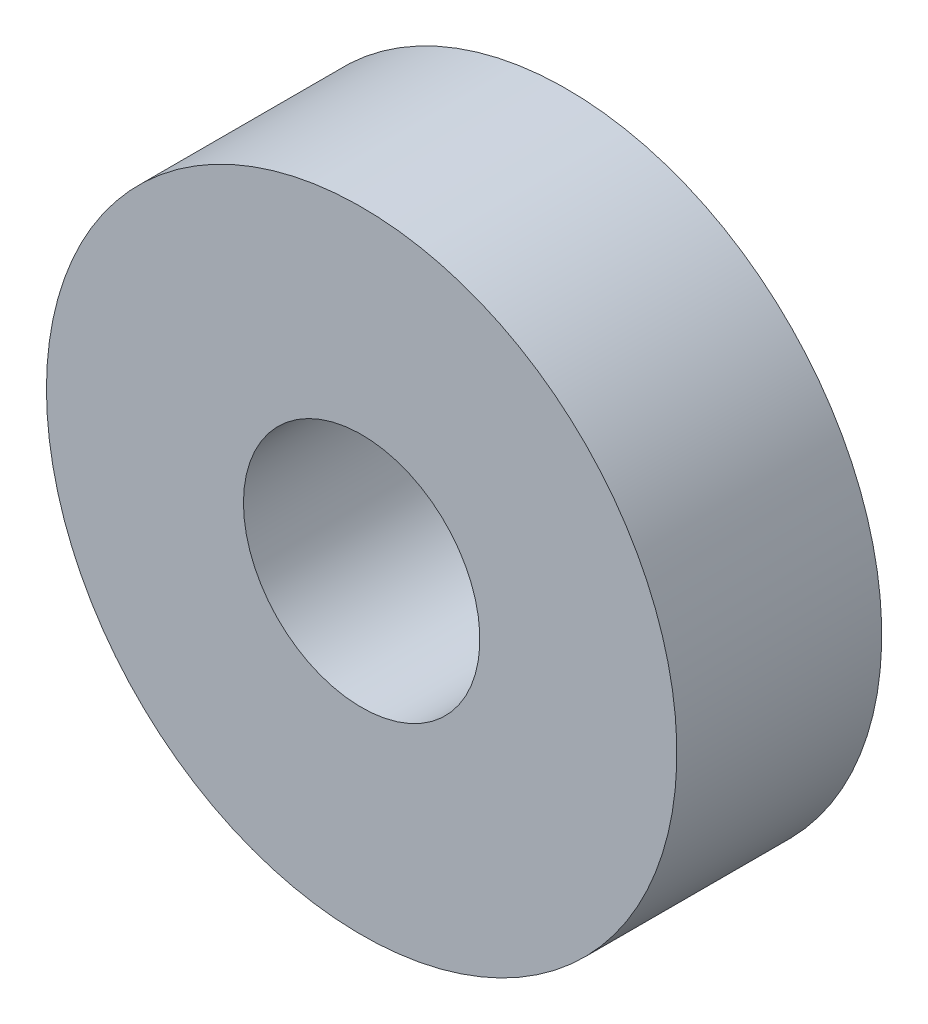
ISO-10303-21;
HEADER;
FILE_DESCRIPTION(('STEP AP214'),'2;1');
FILE_NAME('part.step','',(''),(''),'','','');
FILE_SCHEMA(('AUTOMOTIVE_DESIGN { 1 0 10303 214 1 1 1 1 }'));
ENDSEC;
DATA;
#1=APPLICATION_CONTEXT('core data for automotive mechanical design processes');
#2=APPLICATION_PROTOCOL_DEFINITION('international standard','automotive_design',2000,#1);
#3=PRODUCT_CONTEXT('',#1,'mechanical');
#4=PRODUCT('Part','Part','',(#3));
#5=PRODUCT_RELATED_PRODUCT_CATEGORY('part','',(#4));
#6=PRODUCT_DEFINITION_FORMATION('','',#4);
#7=PRODUCT_DEFINITION_CONTEXT('part definition',#1,'design');
#8=PRODUCT_DEFINITION('design','',#6,#7);
#9=PRODUCT_DEFINITION_SHAPE('','',#8);
#10=(LENGTH_UNIT() NAMED_UNIT(*) SI_UNIT(.MILLI.,.METRE.));
#11=(NAMED_UNIT(*) PLANE_ANGLE_UNIT() SI_UNIT($,.RADIAN.));
#12=(NAMED_UNIT(*) SI_UNIT($,.STERADIAN.) SOLID_ANGLE_UNIT());
#13=UNCERTAINTY_MEASURE_WITH_UNIT(LENGTH_MEASURE(1.E-05),#10,'distance_accuracy_value','');
#14=(GEOMETRIC_REPRESENTATION_CONTEXT(3) GLOBAL_UNCERTAINTY_ASSIGNED_CONTEXT((#13)) GLOBAL_UNIT_ASSIGNED_CONTEXT((#10,
#11,#12)) REPRESENTATION_CONTEXT('',''));
#15=CARTESIAN_POINT('',(0.,0.,0.));
#16=DIRECTION('',(0.,0.,1.));
#17=DIRECTION('',(1.,0.,0.));
#18=AXIS2_PLACEMENT_3D('',#15,#16,#17);
#19=CARTESIAN_POINT('',(0.,0.,13.));
#20=DIRECTION('',(0.,0.,1.));
#21=DIRECTION('',(1.,0.,0.));
#22=AXIS2_PLACEMENT_3D('',#19,#20,#21);
#23=PLANE('',#22);
#24=CARTESIAN_POINT('',(0.,0.,13.));
#25=DIRECTION('',(0.,0.,1.));
#26=DIRECTION('',(1.,0.,0.));
#27=AXIS2_PLACEMENT_3D('',#24,#25,#26);
#28=CIRCLE('',#27,20.);
#29=CARTESIAN_POINT('',(-20.,0.,13.));
#30=VERTEX_POINT('',#29);
#31=EDGE_CURVE('E10',#30,#30,#28,.T.);
#32=ORIENTED_EDGE('',*,*,#31,.T.);
#33=EDGE_LOOP('',(#32));
#34=FACE_BOUND('',#33,.T.);
#35=CARTESIAN_POINT('',(0.,0.,13.));
#36=DIRECTION('',(0.,0.,1.));
#37=DIRECTION('',(1.,0.,0.));
#38=AXIS2_PLACEMENT_3D('',#35,#36,#37);
#39=CIRCLE('',#38,7.5);
#40=CARTESIAN_POINT('',(-7.5,0.,13.));
#41=VERTEX_POINT('',#40);
#42=EDGE_CURVE('E48',#41,#41,#39,.T.);
#43=ORIENTED_EDGE('',*,*,#42,.F.);
#44=EDGE_LOOP('',(#43));
#45=FACE_BOUND('',#44,.T.);
#46=ADVANCED_FACE('F37',(#34,#45),#23,.T.);
#47=CARTESIAN_POINT('',(0.,0.,0.));
#48=DIRECTION('',(0.,0.,1.));
#49=DIRECTION('',(1.,0.,0.));
#50=AXIS2_PLACEMENT_3D('',#47,#48,#49);
#51=PLANE('',#50);
#52=CARTESIAN_POINT('',(0.,0.,0.));
#53=DIRECTION('',(0.,0.,1.));
#54=DIRECTION('',(1.,0.,0.));
#55=AXIS2_PLACEMENT_3D('',#52,#53,#54);
#56=CIRCLE('',#55,20.);
#57=CARTESIAN_POINT('',(-20.,0.,0.));
#58=VERTEX_POINT('',#57);
#59=EDGE_CURVE('E41',#58,#58,#56,.T.);
#60=ORIENTED_EDGE('',*,*,#59,.F.);
#61=EDGE_LOOP('',(#60));
#62=FACE_BOUND('',#61,.T.);
#63=CARTESIAN_POINT('',(0.,0.,0.));
#64=DIRECTION('',(0.,0.,1.));
#65=DIRECTION('',(1.,0.,0.));
#66=AXIS2_PLACEMENT_3D('',#63,#64,#65);
#67=CIRCLE('',#66,7.5);
#68=CARTESIAN_POINT('',(-7.5,0.,0.));
#69=VERTEX_POINT('',#68);
#70=EDGE_CURVE('E50',#69,#69,#67,.T.);
#71=ORIENTED_EDGE('',*,*,#70,.T.);
#72=EDGE_LOOP('',(#71));
#73=FACE_BOUND('',#72,.T.);
#74=ADVANCED_FACE('F60',(#62,#73),#51,.F.);
#75=CARTESIAN_POINT('',(0.,0.,13.));
#76=DIRECTION('',(0.,0.,-1.));
#77=DIRECTION('',(-1.,0.,0.));
#78=AXIS2_PLACEMENT_3D('',#75,#76,#77);
#79=CYLINDRICAL_SURFACE('',#78,20.);
#80=CARTESIAN_POINT('',(-20.,0.,13.));
#81=CARTESIAN_POINT('',(-20.,0.,12.8645833333333));
#82=CARTESIAN_POINT('',(-20.,0.,12.7291666666667));
#83=CARTESIAN_POINT('',(-20.,0.,12.4583333333333));
#84=CARTESIAN_POINT('',(-20.,0.,12.3229166666667));
#85=CARTESIAN_POINT('',(-20.,0.,12.0520833333333));
#86=CARTESIAN_POINT('',(-20.,0.,11.9166666666667));
#87=CARTESIAN_POINT('',(-20.,0.,11.6458333333333));
#88=CARTESIAN_POINT('',(-20.,0.,11.5104166666667));
#89=CARTESIAN_POINT('',(-20.,0.,11.2395833333333));
#90=CARTESIAN_POINT('',(-20.,0.,11.1041666666667));
#91=CARTESIAN_POINT('',(-20.,0.,10.8333333333333));
#92=CARTESIAN_POINT('',(-20.,0.,10.6979166666667));
#93=CARTESIAN_POINT('',(-20.,0.,10.4270833333333));
#94=CARTESIAN_POINT('',(-20.,0.,10.2916666666667));
#95=CARTESIAN_POINT('',(-20.,0.,10.0208333333333));
#96=CARTESIAN_POINT('',(-20.,0.,9.88541666666667));
#97=CARTESIAN_POINT('',(-20.,0.,9.61458333333333));
#98=CARTESIAN_POINT('',(-20.,0.,9.47916666666667));
#99=CARTESIAN_POINT('',(-20.,0.,9.20833333333333));
#100=CARTESIAN_POINT('',(-20.,0.,9.07291666666666));
#101=CARTESIAN_POINT('',(-20.,0.,8.80208333333333));
#102=CARTESIAN_POINT('',(-20.,0.,8.66666666666667));
#103=CARTESIAN_POINT('',(-20.,0.,8.39583333333333));
#104=CARTESIAN_POINT('',(-20.,0.,8.26041666666667));
#105=CARTESIAN_POINT('',(-20.,0.,7.98958333333333));
#106=CARTESIAN_POINT('',(-20.,0.,7.85416666666667));
#107=CARTESIAN_POINT('',(-20.,0.,7.58333333333333));
#108=CARTESIAN_POINT('',(-20.,0.,7.44791666666667));
#109=CARTESIAN_POINT('',(-20.,0.,7.17708333333333));
#110=CARTESIAN_POINT('',(-20.,0.,7.04166666666667));
#111=CARTESIAN_POINT('',(-20.,0.,6.77083333333333));
#112=CARTESIAN_POINT('',(-20.,0.,6.63541666666667));
#113=CARTESIAN_POINT('',(-20.,0.,6.36458333333333));
#114=CARTESIAN_POINT('',(-20.,0.,6.22916666666667));
#115=CARTESIAN_POINT('',(-20.,0.,5.95833333333333));
#116=CARTESIAN_POINT('',(-20.,0.,5.82291666666667));
#117=CARTESIAN_POINT('',(-20.,0.,5.55208333333333));
#118=CARTESIAN_POINT('',(-20.,0.,5.41666666666667));
#119=CARTESIAN_POINT('',(-20.,0.,5.14583333333333));
#120=CARTESIAN_POINT('',(-20.,0.,5.01041666666667));
#121=CARTESIAN_POINT('',(-20.,0.,4.73958333333333));
#122=CARTESIAN_POINT('',(-20.,0.,4.60416666666667));
#123=CARTESIAN_POINT('',(-20.,0.,4.33333333333333));
#124=CARTESIAN_POINT('',(-20.,0.,4.19791666666667));
#125=CARTESIAN_POINT('',(-20.,0.,3.92708333333333));
#126=CARTESIAN_POINT('',(-20.,0.,3.79166666666667));
#127=CARTESIAN_POINT('',(-20.,0.,3.52083333333333));
#128=CARTESIAN_POINT('',(-20.,0.,3.38541666666667));
#129=CARTESIAN_POINT('',(-20.,0.,3.11458333333333));
#130=CARTESIAN_POINT('',(-20.,0.,2.97916666666667));
#131=CARTESIAN_POINT('',(-20.,0.,2.70833333333333));
#132=CARTESIAN_POINT('',(-20.,0.,2.57291666666667));
#133=CARTESIAN_POINT('',(-20.,0.,2.30208333333333));
#134=CARTESIAN_POINT('',(-20.,0.,2.16666666666667));
#135=CARTESIAN_POINT('',(-20.,0.,1.89583333333333));
#136=CARTESIAN_POINT('',(-20.,0.,1.76041666666667));
#137=CARTESIAN_POINT('',(-20.,0.,1.48958333333333));
#138=CARTESIAN_POINT('',(-20.,0.,1.35416666666667));
#139=CARTESIAN_POINT('',(-20.,0.,1.08333333333333));
#140=CARTESIAN_POINT('',(-20.,0.,0.947916666666667));
#141=CARTESIAN_POINT('',(-20.,0.,0.677083333333334));
#142=CARTESIAN_POINT('',(-20.,0.,0.541666666666667));
#143=CARTESIAN_POINT('',(-20.,0.,0.270833333333334));
#144=CARTESIAN_POINT('',(-20.,0.,0.135416666666667));
#145=CARTESIAN_POINT('',(-20.,0.,0.));
#146=B_SPLINE_CURVE_WITH_KNOTS('',3,(#80,#81,#82,#83,#84,#85,#86,#87,#88,#89,#90,#91,#92,#93,
#94,#95,#96,#97,#98,#99,#100,#101,#102,#103,#104,#105,#106,#107,#108,#109,#110,#111,#112,#113,
#114,#115,#116,#117,#118,#119,#120,#121,#122,#123,#124,#125,#126,#127,#128,#129,#130,#131,#132,
#133,#134,#135,#136,#137,#138,#139,#140,#141,#142,#143,#144,#145),.UNSPECIFIED.,.F.,.F.,(4,2,2,
2,2,2,2,2,2,2,2,2,2,2,2,2,2,2,2,2,2,2,2,2,2,2,2,2,2,2,2,2,4),(0.,0.40625,0.812500000000001,
1.21875,1.625,2.03125,2.4375,2.84375,3.25,3.65625,4.0625,4.46875,4.875,5.28125,5.6875,6.09375,
6.5,6.90625,7.3125,7.71875,8.125,8.53125,8.9375,9.34375,9.75,10.15625,10.5625,10.96875,11.375,
11.78125,12.1875,12.59375,13.),.UNSPECIFIED.);
#147=EDGE_CURVE('BSEAM39',#30,#58,#146,.T.);
#148=ORIENTED_EDGE('',*,*,#31,.F.);
#149=ORIENTED_EDGE('',*,*,#59,.T.);
#150=ORIENTED_EDGE('',*,*,#147,.T.);
#151=ORIENTED_EDGE('',*,*,#147,.F.);
#152=EDGE_LOOP('',(#148,#150,#149,#151));
#153=FACE_BOUND('',#152,.T.);
#154=ADVANCED_FACE('F39',(#153),#79,.T.);
#155=CARTESIAN_POINT('',(0.,0.,13.));
#156=DIRECTION('',(0.,0.,-1.));
#157=DIRECTION('',(-1.,0.,0.));
#158=AXIS2_PLACEMENT_3D('',#155,#156,#157);
#159=CYLINDRICAL_SURFACE('',#158,7.5);
#160=CARTESIAN_POINT('',(-7.5,0.,13.));
#161=CARTESIAN_POINT('',(-7.5,0.,12.8645833333333));
#162=CARTESIAN_POINT('',(-7.5,0.,12.7291666666667));
#163=CARTESIAN_POINT('',(-7.5,0.,12.4583333333333));
#164=CARTESIAN_POINT('',(-7.5,0.,12.3229166666667));
#165=CARTESIAN_POINT('',(-7.5,0.,12.0520833333333));
#166=CARTESIAN_POINT('',(-7.5,0.,11.9166666666667));
#167=CARTESIAN_POINT('',(-7.5,0.,11.6458333333333));
#168=CARTESIAN_POINT('',(-7.5,0.,11.5104166666667));
#169=CARTESIAN_POINT('',(-7.5,0.,11.2395833333333));
#170=CARTESIAN_POINT('',(-7.5,0.,11.1041666666667));
#171=CARTESIAN_POINT('',(-7.5,0.,10.8333333333333));
#172=CARTESIAN_POINT('',(-7.5,0.,10.6979166666667));
#173=CARTESIAN_POINT('',(-7.5,0.,10.4270833333333));
#174=CARTESIAN_POINT('',(-7.5,0.,10.2916666666667));
#175=CARTESIAN_POINT('',(-7.5,0.,10.0208333333333));
#176=CARTESIAN_POINT('',(-7.5,0.,9.88541666666667));
#177=CARTESIAN_POINT('',(-7.5,0.,9.61458333333333));
#178=CARTESIAN_POINT('',(-7.5,0.,9.47916666666667));
#179=CARTESIAN_POINT('',(-7.5,0.,9.20833333333333));
#180=CARTESIAN_POINT('',(-7.5,0.,9.07291666666666));
#181=CARTESIAN_POINT('',(-7.5,0.,8.80208333333333));
#182=CARTESIAN_POINT('',(-7.5,0.,8.66666666666667));
#183=CARTESIAN_POINT('',(-7.5,0.,8.39583333333333));
#184=CARTESIAN_POINT('',(-7.5,0.,8.26041666666667));
#185=CARTESIAN_POINT('',(-7.5,0.,7.98958333333333));
#186=CARTESIAN_POINT('',(-7.5,0.,7.85416666666667));
#187=CARTESIAN_POINT('',(-7.5,0.,7.58333333333333));
#188=CARTESIAN_POINT('',(-7.5,0.,7.44791666666667));
#189=CARTESIAN_POINT('',(-7.5,0.,7.17708333333333));
#190=CARTESIAN_POINT('',(-7.5,0.,7.04166666666667));
#191=CARTESIAN_POINT('',(-7.5,0.,6.77083333333333));
#192=CARTESIAN_POINT('',(-7.5,0.,6.63541666666667));
#193=CARTESIAN_POINT('',(-7.5,0.,6.36458333333333));
#194=CARTESIAN_POINT('',(-7.5,0.,6.22916666666667));
#195=CARTESIAN_POINT('',(-7.5,0.,5.95833333333333));
#196=CARTESIAN_POINT('',(-7.5,0.,5.82291666666667));
#197=CARTESIAN_POINT('',(-7.5,0.,5.55208333333333));
#198=CARTESIAN_POINT('',(-7.5,0.,5.41666666666667));
#199=CARTESIAN_POINT('',(-7.5,0.,5.14583333333333));
#200=CARTESIAN_POINT('',(-7.5,0.,5.01041666666667));
#201=CARTESIAN_POINT('',(-7.5,0.,4.73958333333333));
#202=CARTESIAN_POINT('',(-7.5,0.,4.60416666666667));
#203=CARTESIAN_POINT('',(-7.5,0.,4.33333333333333));
#204=CARTESIAN_POINT('',(-7.5,0.,4.19791666666667));
#205=CARTESIAN_POINT('',(-7.5,0.,3.92708333333333));
#206=CARTESIAN_POINT('',(-7.5,0.,3.79166666666667));
#207=CARTESIAN_POINT('',(-7.5,0.,3.52083333333333));
#208=CARTESIAN_POINT('',(-7.5,0.,3.38541666666667));
#209=CARTESIAN_POINT('',(-7.5,0.,3.11458333333333));
#210=CARTESIAN_POINT('',(-7.5,0.,2.97916666666667));
#211=CARTESIAN_POINT('',(-7.5,0.,2.70833333333333));
#212=CARTESIAN_POINT('',(-7.5,0.,2.57291666666667));
#213=CARTESIAN_POINT('',(-7.5,0.,2.30208333333333));
#214=CARTESIAN_POINT('',(-7.5,0.,2.16666666666667));
#215=CARTESIAN_POINT('',(-7.5,0.,1.89583333333333));
#216=CARTESIAN_POINT('',(-7.5,0.,1.76041666666667));
#217=CARTESIAN_POINT('',(-7.5,0.,1.48958333333333));
#218=CARTESIAN_POINT('',(-7.5,0.,1.35416666666667));
#219=CARTESIAN_POINT('',(-7.5,0.,1.08333333333333));
#220=CARTESIAN_POINT('',(-7.5,0.,0.947916666666667));
#221=CARTESIAN_POINT('',(-7.5,0.,0.677083333333334));
#222=CARTESIAN_POINT('',(-7.5,0.,0.541666666666667));
#223=CARTESIAN_POINT('',(-7.5,0.,0.270833333333334));
#224=CARTESIAN_POINT('',(-7.5,0.,0.135416666666667));
#225=CARTESIAN_POINT('',(-7.5,0.,0.));
#226=B_SPLINE_CURVE_WITH_KNOTS('',3,(#160,#161,#162,#163,#164,#165,#166,#167,#168,#169,#170,
#171,#172,#173,#174,#175,#176,#177,#178,#179,#180,#181,#182,#183,#184,#185,#186,#187,#188,#189,
#190,#191,#192,#193,#194,#195,#196,#197,#198,#199,#200,#201,#202,#203,#204,#205,#206,#207,#208,
#209,#210,#211,#212,#213,#214,#215,#216,#217,#218,#219,#220,#221,#222,#223,#224,#225),
.UNSPECIFIED.,.F.,.F.,(4,2,2,2,2,2,2,2,2,2,2,2,2,2,2,2,2,2,2,2,2,2,2,2,2,2,2,2,2,2,2,2,4),(0.,
0.40625,0.812500000000001,1.21875,1.625,2.03125,2.4375,2.84375,3.25,3.65625,4.0625,4.46875,
4.875,5.28125,5.6875,6.09375,6.5,6.90625,7.3125,7.71875,8.125,8.53125,8.9375,9.34375,9.75,
10.15625,10.5625,10.96875,11.375,11.78125,12.1875,12.59375,13.),.UNSPECIFIED.);
#227=EDGE_CURVE('BSEAM56',#41,#69,#226,.T.);
#228=ORIENTED_EDGE('',*,*,#42,.T.);
#229=ORIENTED_EDGE('',*,*,#70,.F.);
#230=ORIENTED_EDGE('',*,*,#227,.T.);
#231=ORIENTED_EDGE('',*,*,#227,.F.);
#232=EDGE_LOOP('',(#228,#230,#229,#231));
#233=FACE_BOUND('',#232,.T.);
#234=ADVANCED_FACE('F56',(#233),#159,.F.);
#235=CLOSED_SHELL('',(#46,#74,#154,#234));
#236=MANIFOLD_SOLID_BREP('B2',#235);
#237=ADVANCED_BREP_SHAPE_REPRESENTATION('',(#18,#236),#14);
#238=SHAPE_DEFINITION_REPRESENTATION(#9,#237);
ENDSEC;
END-ISO-10303-21;
